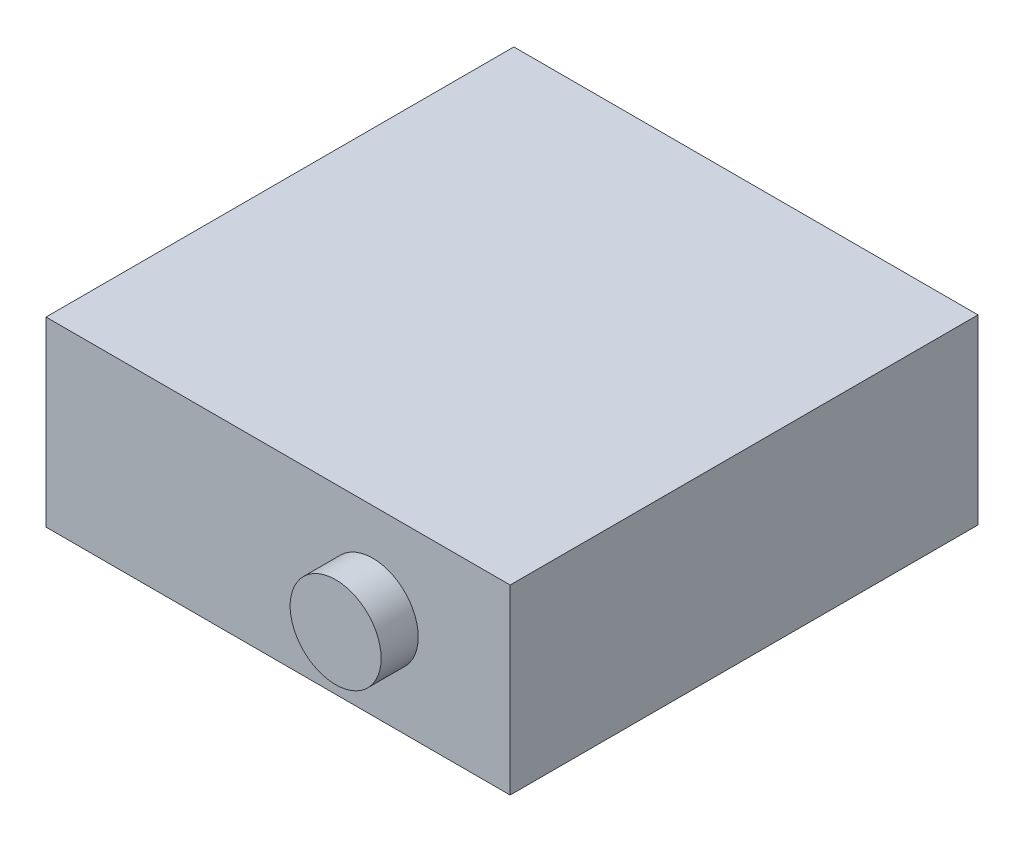
ISO-10303-21;
HEADER;
FILE_DESCRIPTION(('STEP AP214'),'2;1');
FILE_NAME('part.step','',(''),(''),'','','');
FILE_SCHEMA(('AUTOMOTIVE_DESIGN { 1 0 10303 214 1 1 1 1 }'));
ENDSEC;
DATA;
#1=APPLICATION_CONTEXT('core data for automotive mechanical design processes');
#2=APPLICATION_PROTOCOL_DEFINITION('international standard','automotive_design',2000,#1);
#3=PRODUCT_CONTEXT('',#1,'mechanical');
#4=PRODUCT('Part','Part','',(#3));
#5=PRODUCT_RELATED_PRODUCT_CATEGORY('part','',(#4));
#6=PRODUCT_DEFINITION_FORMATION('','',#4);
#7=PRODUCT_DEFINITION_CONTEXT('part definition',#1,'design');
#8=PRODUCT_DEFINITION('design','',#6,#7);
#9=PRODUCT_DEFINITION_SHAPE('','',#8);
#10=(LENGTH_UNIT() NAMED_UNIT(*) SI_UNIT(.MILLI.,.METRE.));
#11=(NAMED_UNIT(*) PLANE_ANGLE_UNIT() SI_UNIT($,.RADIAN.));
#12=(NAMED_UNIT(*) SI_UNIT($,.STERADIAN.) SOLID_ANGLE_UNIT());
#13=UNCERTAINTY_MEASURE_WITH_UNIT(LENGTH_MEASURE(1.E-05),#10,'distance_accuracy_value','');
#14=(GEOMETRIC_REPRESENTATION_CONTEXT(3) GLOBAL_UNCERTAINTY_ASSIGNED_CONTEXT((#13)) GLOBAL_UNIT_ASSIGNED_CONTEXT((#10,
#11,#12)) REPRESENTATION_CONTEXT('',''));
#15=CARTESIAN_POINT('',(0.,0.,0.));
#16=DIRECTION('',(0.,0.,1.));
#17=DIRECTION('',(1.,0.,0.));
#18=AXIS2_PLACEMENT_3D('',#15,#16,#17);
#19=CARTESIAN_POINT('',(0.,0.,32.004));
#20=DIRECTION('',(1.,0.,0.));
#21=DIRECTION('',(0.,1.,0.));
#22=AXIS2_PLACEMENT_3D('',#19,#20,#21);
#23=PLANE('',#22);
#24=DIRECTION('',(0.,-1.,0.));
#25=VECTOR('',#24,1.);
#26=CARTESIAN_POINT('',(0.,0.,0.));
#27=LINE('',#26,#25);
#28=CARTESIAN_POINT('',(0.,0.,0.));
#29=VERTEX_POINT('',#28);
#30=CARTESIAN_POINT('',(0.,-12.446,0.));
#31=VERTEX_POINT('',#30);
#32=EDGE_CURVE('E102',#29,#31,#27,.T.);
#33=ORIENTED_EDGE('',*,*,#32,.T.);
#34=DIRECTION('',(0.,0.,-1.));
#35=VECTOR('',#34,1.);
#36=CARTESIAN_POINT('',(0.,-12.446,32.004));
#37=LINE('',#36,#35);
#38=CARTESIAN_POINT('',(0.,-12.446,32.004));
#39=VERTEX_POINT('',#38);
#40=EDGE_CURVE('E11',#39,#31,#37,.T.);
#41=ORIENTED_EDGE('',*,*,#40,.F.);
#42=DIRECTION('',(0.,-1.,0.));
#43=VECTOR('',#42,1.);
#44=CARTESIAN_POINT('',(0.,0.,32.004));
#45=LINE('',#44,#43);
#46=CARTESIAN_POINT('',(0.,0.,32.004));
#47=VERTEX_POINT('',#46);
#48=EDGE_CURVE('E90',#47,#39,#45,.T.);
#49=ORIENTED_EDGE('',*,*,#48,.F.);
#50=DIRECTION('',(0.,0.,-1.));
#51=VECTOR('',#50,1.);
#52=CARTESIAN_POINT('',(0.,0.,32.004));
#53=LINE('',#52,#51);
#54=EDGE_CURVE('E98',#47,#29,#53,.T.);
#55=ORIENTED_EDGE('',*,*,#54,.T.);
#56=EDGE_LOOP('',(#33,#41,#49,#55));
#57=FACE_BOUND('',#56,.T.);
#58=ADVANCED_FACE('F39',(#57),#23,.F.);
#59=CARTESIAN_POINT('',(0.,-12.446,32.004));
#60=DIRECTION('',(0.,1.,0.));
#61=DIRECTION('',(0.,0.,1.));
#62=AXIS2_PLACEMENT_3D('',#59,#60,#61);
#63=PLANE('',#62);
#64=DIRECTION('',(1.,0.,0.));
#65=VECTOR('',#64,1.);
#66=CARTESIAN_POINT('',(0.,-12.446,0.));
#67=LINE('',#66,#65);
#68=CARTESIAN_POINT('',(31.75,-12.446,0.));
#69=VERTEX_POINT('',#68);
#70=EDGE_CURVE('E94',#31,#69,#67,.T.);
#71=ORIENTED_EDGE('',*,*,#70,.T.);
#72=DIRECTION('',(0.,0.,-1.));
#73=VECTOR('',#72,1.);
#74=CARTESIAN_POINT('',(31.75,-12.446,32.004));
#75=LINE('',#74,#73);
#76=CARTESIAN_POINT('',(31.75,-12.446,32.004));
#77=VERTEX_POINT('',#76);
#78=EDGE_CURVE('E47',#77,#69,#75,.T.);
#79=ORIENTED_EDGE('',*,*,#78,.F.);
#80=DIRECTION('',(1.,0.,0.));
#81=VECTOR('',#80,1.);
#82=CARTESIAN_POINT('',(0.,-12.446,32.004));
#83=LINE('',#82,#81);
#84=EDGE_CURVE('E85',#39,#77,#83,.T.);
#85=ORIENTED_EDGE('',*,*,#84,.F.);
#86=ORIENTED_EDGE('',*,*,#40,.T.);
#87=EDGE_LOOP('',(#71,#79,#85,#86));
#88=FACE_BOUND('',#87,.T.);
#89=ADVANCED_FACE('F93',(#88),#63,.F.);
#90=CARTESIAN_POINT('',(31.75,0.,32.004));
#91=DIRECTION('',(-1.,0.,0.));
#92=DIRECTION('',(0.,-1.,0.));
#93=AXIS2_PLACEMENT_3D('',#90,#91,#92);
#94=PLANE('',#93);
#95=DIRECTION('',(0.,1.,0.));
#96=VECTOR('',#95,1.);
#97=CARTESIAN_POINT('',(31.75,0.,0.));
#98=LINE('',#97,#96);
#99=CARTESIAN_POINT('',(31.75,0.,0.));
#100=VERTEX_POINT('',#99);
#101=EDGE_CURVE('E72',#69,#100,#98,.T.);
#102=ORIENTED_EDGE('',*,*,#101,.T.);
#103=DIRECTION('',(0.,0.,-1.));
#104=VECTOR('',#103,1.);
#105=CARTESIAN_POINT('',(31.75,0.,32.004));
#106=LINE('',#105,#104);
#107=CARTESIAN_POINT('',(31.75,0.,32.004));
#108=VERTEX_POINT('',#107);
#109=EDGE_CURVE('E95',#108,#100,#106,.T.);
#110=ORIENTED_EDGE('',*,*,#109,.F.);
#111=DIRECTION('',(0.,1.,0.));
#112=VECTOR('',#111,1.);
#113=CARTESIAN_POINT('',(31.75,0.,32.004));
#114=LINE('',#113,#112);
#115=EDGE_CURVE('E88',#77,#108,#114,.T.);
#116=ORIENTED_EDGE('',*,*,#115,.F.);
#117=ORIENTED_EDGE('',*,*,#78,.T.);
#118=EDGE_LOOP('',(#102,#110,#116,#117));
#119=FACE_BOUND('',#118,.T.);
#120=ADVANCED_FACE('F96',(#119),#94,.F.);
#121=CARTESIAN_POINT('',(0.,0.,32.004));
#122=DIRECTION('',(0.,-1.,0.));
#123=DIRECTION('',(0.,0.,-1.));
#124=AXIS2_PLACEMENT_3D('',#121,#122,#123);
#125=PLANE('',#124);
#126=DIRECTION('',(-1.,0.,0.));
#127=VECTOR('',#126,1.);
#128=CARTESIAN_POINT('',(0.,0.,0.));
#129=LINE('',#128,#127);
#130=EDGE_CURVE('E78',#100,#29,#129,.T.);
#131=ORIENTED_EDGE('',*,*,#130,.T.);
#132=ORIENTED_EDGE('',*,*,#54,.F.);
#133=DIRECTION('',(-1.,0.,0.));
#134=VECTOR('',#133,1.);
#135=CARTESIAN_POINT('',(0.,0.,32.004));
#136=LINE('',#135,#134);
#137=EDGE_CURVE('E55',#108,#47,#136,.T.);
#138=ORIENTED_EDGE('',*,*,#137,.F.);
#139=ORIENTED_EDGE('',*,*,#109,.T.);
#140=EDGE_LOOP('',(#131,#132,#138,#139));
#141=FACE_BOUND('',#140,.T.);
#142=ADVANCED_FACE('F110',(#141),#125,.F.);
#143=CARTESIAN_POINT('',(0.,0.,32.004));
#144=DIRECTION('',(0.,0.,1.));
#145=DIRECTION('',(1.,0.,0.));
#146=AXIS2_PLACEMENT_3D('',#143,#144,#145);
#147=PLANE('',#146);
#148=CARTESIAN_POINT('',(22.352,-6.223,32.004));
#149=DIRECTION('',(0.,0.,1.));
#150=DIRECTION('',(1.,0.,0.));
#151=AXIS2_PLACEMENT_3D('',#148,#149,#150);
#152=CIRCLE('',#151,3.1115);
#153=CARTESIAN_POINT('',(25.4635,-6.223,32.004));
#154=VERTEX_POINT('',#153);
#155=EDGE_CURVE('E116',#154,#154,#152,.T.);
#156=ORIENTED_EDGE('',*,*,#155,.F.);
#157=EDGE_LOOP('',(#156));
#158=FACE_BOUND('',#157,.T.);
#159=ORIENTED_EDGE('',*,*,#48,.T.);
#160=ORIENTED_EDGE('',*,*,#84,.T.);
#161=ORIENTED_EDGE('',*,*,#115,.T.);
#162=ORIENTED_EDGE('',*,*,#137,.T.);
#163=EDGE_LOOP('',(#159,#160,#161,#162));
#164=FACE_BOUND('',#163,.T.);
#165=ADVANCED_FACE('F86',(#158,#164),#147,.T.);
#166=CARTESIAN_POINT('',(0.,0.,0.));
#167=DIRECTION('',(0.,0.,1.));
#168=DIRECTION('',(1.,0.,0.));
#169=AXIS2_PLACEMENT_3D('',#166,#167,#168);
#170=PLANE('',#169);
#171=ORIENTED_EDGE('',*,*,#32,.F.);
#172=ORIENTED_EDGE('',*,*,#130,.F.);
#173=ORIENTED_EDGE('',*,*,#101,.F.);
#174=ORIENTED_EDGE('',*,*,#70,.F.);
#175=EDGE_LOOP('',(#171,#172,#173,#174));
#176=FACE_BOUND('',#175,.T.);
#177=ADVANCED_FACE('F113',(#176),#170,.F.);
#178=CARTESIAN_POINT('',(22.352,-6.223,34.544));
#179=DIRECTION('',(0.,0.,-1.));
#180=DIRECTION('',(-1.,0.,0.));
#181=AXIS2_PLACEMENT_3D('',#178,#179,#180);
#182=CYLINDRICAL_SURFACE('',#181,3.1115);
#183=CARTESIAN_POINT('',(22.352,-6.223,34.544));
#184=DIRECTION('',(0.,0.,1.));
#185=DIRECTION('',(1.,0.,0.));
#186=AXIS2_PLACEMENT_3D('',#183,#184,#185);
#187=CIRCLE('',#186,3.1115);
#188=CARTESIAN_POINT('',(25.4635,-6.223,34.544));
#189=VERTEX_POINT('',#188);
#190=EDGE_CURVE('E105',#189,#189,#187,.T.);
#191=ORIENTED_EDGE('',*,*,#190,.F.);
#192=EDGE_LOOP('',(#191));
#193=FACE_BOUND('',#192,.T.);
#194=ORIENTED_EDGE('',*,*,#155,.T.);
#195=EDGE_LOOP('',(#194));
#196=FACE_BOUND('',#195,.T.);
#197=ADVANCED_FACE('F124',(#193,#196),#182,.T.);
#198=CARTESIAN_POINT('',(22.352,-6.223,34.544));
#199=DIRECTION('',(0.,0.,1.));
#200=DIRECTION('',(1.,0.,0.));
#201=AXIS2_PLACEMENT_3D('',#198,#199,#200);
#202=PLANE('',#201);
#203=ORIENTED_EDGE('',*,*,#190,.T.);
#204=EDGE_LOOP('',(#203));
#205=FACE_BOUND('',#204,.T.);
#206=ADVANCED_FACE('F122',(#205),#202,.T.);
#207=CLOSED_SHELL('',(#58,#89,#120,#142,#165,#177,#197,#206));
#208=MANIFOLD_SOLID_BREP('B2',#207);
#209=ADVANCED_BREP_SHAPE_REPRESENTATION('',(#18,#208),#14);
#210=SHAPE_DEFINITION_REPRESENTATION(#9,#209);
ENDSEC;
END-ISO-10303-21;
